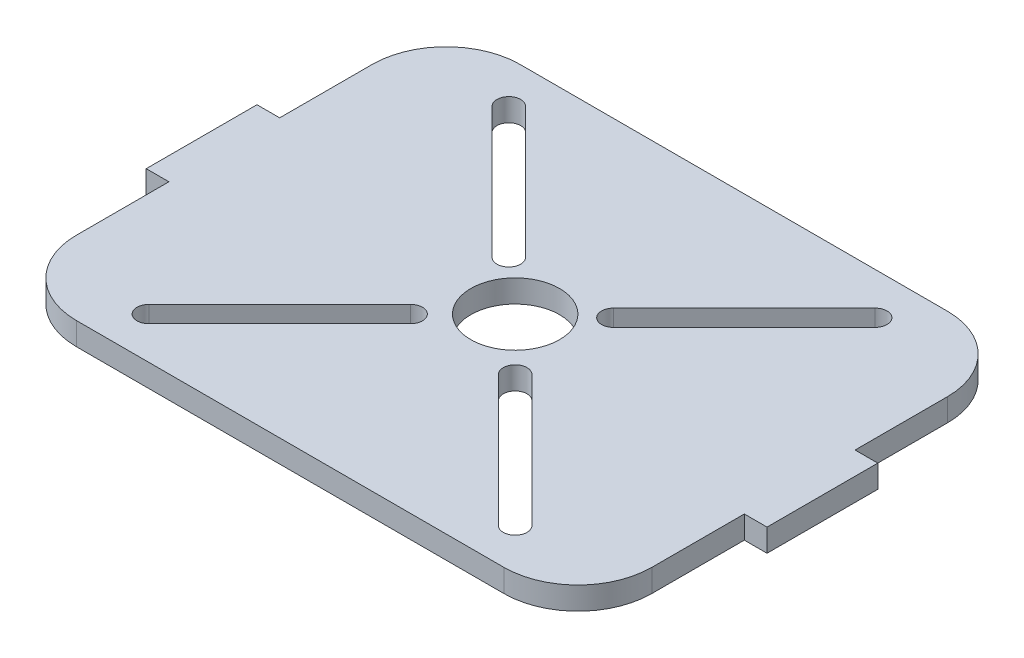
ISO-10303-21;
HEADER;
FILE_DESCRIPTION(('STEP AP214'),'2;1');
FILE_NAME('part.step','',(''),(''),'','','');
FILE_SCHEMA(('AUTOMOTIVE_DESIGN { 1 0 10303 214 1 1 1 1 }'));
ENDSEC;
DATA;
#1=APPLICATION_CONTEXT('core data for automotive mechanical design processes');
#2=APPLICATION_PROTOCOL_DEFINITION('international standard','automotive_design',2000,#1);
#3=PRODUCT_CONTEXT('',#1,'mechanical');
#4=PRODUCT('Part','Part','',(#3));
#5=PRODUCT_RELATED_PRODUCT_CATEGORY('part','',(#4));
#6=PRODUCT_DEFINITION_FORMATION('','',#4);
#7=PRODUCT_DEFINITION_CONTEXT('part definition',#1,'design');
#8=PRODUCT_DEFINITION('design','',#6,#7);
#9=PRODUCT_DEFINITION_SHAPE('','',#8);
#10=(LENGTH_UNIT() NAMED_UNIT(*) SI_UNIT(.MILLI.,.METRE.));
#11=(NAMED_UNIT(*) PLANE_ANGLE_UNIT() SI_UNIT($,.RADIAN.));
#12=(NAMED_UNIT(*) SI_UNIT($,.STERADIAN.) SOLID_ANGLE_UNIT());
#13=UNCERTAINTY_MEASURE_WITH_UNIT(LENGTH_MEASURE(1.E-05),#10,'distance_accuracy_value','');
#14=(GEOMETRIC_REPRESENTATION_CONTEXT(3) GLOBAL_UNCERTAINTY_ASSIGNED_CONTEXT((#13)) GLOBAL_UNIT_ASSIGNED_CONTEXT((#10,
#11,#12)) REPRESENTATION_CONTEXT('',''));
#15=CARTESIAN_POINT('',(0.,0.,0.));
#16=DIRECTION('',(0.,0.,1.));
#17=DIRECTION('',(1.,0.,0.));
#18=AXIS2_PLACEMENT_3D('',#15,#16,#17);
#19=CARTESIAN_POINT('',(0.,-386.85,0.));
#20=DIRECTION('',(0.,-1.,0.));
#21=DIRECTION('',(0.,0.,-1.));
#22=AXIS2_PLACEMENT_3D('',#19,#20,#21);
#23=PLANE('',#22);
#24=DIRECTION('',(-1.,0.,0.));
#25=VECTOR('',#24,1.);
#26=CARTESIAN_POINT('',(-38.9099999999999,-386.85,56.43));
#27=LINE('',#26,#25);
#28=CARTESIAN_POINT('',(28.9099999999999,-386.85,56.43));
#29=VERTEX_POINT('',#28);
#30=CARTESIAN_POINT('',(-28.9099999999999,-386.85,56.43));
#31=VERTEX_POINT('',#30);
#32=EDGE_CURVE('E415',#29,#31,#27,.T.);
#33=ORIENTED_EDGE('',*,*,#32,.T.);
#34=CARTESIAN_POINT('',(-28.9099999999999,-386.85,46.43));
#35=DIRECTION('',(0.,-1.,0.));
#36=DIRECTION('',(0.,0.,-1.));
#37=AXIS2_PLACEMENT_3D('',#34,#35,#36);
#38=CIRCLE('',#37,10.);
#39=CARTESIAN_POINT('',(-38.9099999999999,-386.85,46.43));
#40=VERTEX_POINT('',#39);
#41=EDGE_CURVE('E493',#31,#40,#38,.T.);
#42=ORIENTED_EDGE('',*,*,#41,.T.);
#43=DIRECTION('',(0.,0.,-1.));
#44=VECTOR('',#43,1.);
#45=CARTESIAN_POINT('',(-38.9099999999999,-386.85,33.92));
#46=LINE('',#45,#44);
#47=CARTESIAN_POINT('',(-38.9099999999999,-386.85,33.92));
#48=VERTEX_POINT('',#47);
#49=EDGE_CURVE('E418',#40,#48,#46,.T.);
#50=ORIENTED_EDGE('',*,*,#49,.T.);
#51=DIRECTION('',(-1.,0.,0.));
#52=VECTOR('',#51,1.);
#53=CARTESIAN_POINT('',(-41.9799999999999,-386.85,33.92));
#54=LINE('',#53,#52);
#55=CARTESIAN_POINT('',(-41.9799999999999,-386.85,33.92));
#56=VERTEX_POINT('',#55);
#57=EDGE_CURVE('E420',#48,#56,#54,.T.);
#58=ORIENTED_EDGE('',*,*,#57,.T.);
#59=DIRECTION('',(0.,0.,-1.));
#60=VECTOR('',#59,1.);
#61=CARTESIAN_POINT('',(-41.9799999999999,-386.85,33.92));
#62=LINE('',#61,#60);
#63=CARTESIAN_POINT('',(-41.9799999999999,-386.85,18.94));
#64=VERTEX_POINT('',#63);
#65=EDGE_CURVE('E394',#56,#64,#62,.T.);
#66=ORIENTED_EDGE('',*,*,#65,.T.);
#67=DIRECTION('',(1.,0.,0.));
#68=VECTOR('',#67,1.);
#69=CARTESIAN_POINT('',(-41.9799999999999,-386.85,18.94));
#70=LINE('',#69,#68);
#71=CARTESIAN_POINT('',(-38.9099999999999,-386.85,18.94));
#72=VERTEX_POINT('',#71);
#73=EDGE_CURVE('E397',#64,#72,#70,.T.);
#74=ORIENTED_EDGE('',*,*,#73,.T.);
#75=DIRECTION('',(0.,0.,-1.));
#76=VECTOR('',#75,1.);
#77=CARTESIAN_POINT('',(-38.9099999999999,-386.85,18.94));
#78=LINE('',#77,#76);
#79=CARTESIAN_POINT('',(-38.9099999999999,-386.85,6.43));
#80=VERTEX_POINT('',#79);
#81=EDGE_CURVE('E400',#72,#80,#78,.T.);
#82=ORIENTED_EDGE('',*,*,#81,.T.);
#83=CARTESIAN_POINT('',(-28.9099999999999,-386.85,6.43));
#84=DIRECTION('',(0.,-1.,0.));
#85=DIRECTION('',(0.,0.,-1.));
#86=AXIS2_PLACEMENT_3D('',#83,#84,#85);
#87=CIRCLE('',#86,10.);
#88=CARTESIAN_POINT('',(-28.9099999999999,-386.85,-3.57));
#89=VERTEX_POINT('',#88);
#90=EDGE_CURVE('E491',#80,#89,#87,.T.);
#91=ORIENTED_EDGE('',*,*,#90,.T.);
#92=DIRECTION('',(1.,0.,0.));
#93=VECTOR('',#92,1.);
#94=CARTESIAN_POINT('',(-38.9099999999999,-386.85,-3.57));
#95=LINE('',#94,#93);
#96=CARTESIAN_POINT('',(28.9099999999999,-386.85,-3.57));
#97=VERTEX_POINT('',#96);
#98=EDGE_CURVE('E403',#89,#97,#95,.T.);
#99=ORIENTED_EDGE('',*,*,#98,.T.);
#100=CARTESIAN_POINT('',(28.9099999999999,-386.85,6.43));
#101=DIRECTION('',(0.,-1.,0.));
#102=DIRECTION('',(0.,0.,-1.));
#103=AXIS2_PLACEMENT_3D('',#100,#101,#102);
#104=CIRCLE('',#103,10.);
#105=CARTESIAN_POINT('',(38.9099999999999,-386.85,6.43));
#106=VERTEX_POINT('',#105);
#107=EDGE_CURVE('E64',#97,#106,#104,.T.);
#108=ORIENTED_EDGE('',*,*,#107,.T.);
#109=DIRECTION('',(0.,0.,1.));
#110=VECTOR('',#109,1.);
#111=CARTESIAN_POINT('',(38.9099999999999,-386.85,18.94));
#112=LINE('',#111,#110);
#113=CARTESIAN_POINT('',(38.9099999999999,-386.85,18.94));
#114=VERTEX_POINT('',#113);
#115=EDGE_CURVE('E405',#106,#114,#112,.T.);
#116=ORIENTED_EDGE('',*,*,#115,.T.);
#117=DIRECTION('',(1.,0.,0.));
#118=VECTOR('',#117,1.);
#119=CARTESIAN_POINT('',(41.9799999999999,-386.85,18.94));
#120=LINE('',#119,#118);
#121=CARTESIAN_POINT('',(41.9799999999999,-386.85,18.94));
#122=VERTEX_POINT('',#121);
#123=EDGE_CURVE('E407',#114,#122,#120,.T.);
#124=ORIENTED_EDGE('',*,*,#123,.T.);
#125=DIRECTION('',(0.,0.,1.));
#126=VECTOR('',#125,1.);
#127=CARTESIAN_POINT('',(41.9799999999999,-386.85,33.92));
#128=LINE('',#127,#126);
#129=CARTESIAN_POINT('',(41.9799999999999,-386.85,33.92));
#130=VERTEX_POINT('',#129);
#131=EDGE_CURVE('E409',#122,#130,#128,.T.);
#132=ORIENTED_EDGE('',*,*,#131,.T.);
#133=DIRECTION('',(-1.,0.,0.));
#134=VECTOR('',#133,1.);
#135=CARTESIAN_POINT('',(41.9799999999999,-386.85,33.92));
#136=LINE('',#135,#134);
#137=CARTESIAN_POINT('',(38.9099999999999,-386.85,33.92));
#138=VERTEX_POINT('',#137);
#139=EDGE_CURVE('E411',#130,#138,#136,.T.);
#140=ORIENTED_EDGE('',*,*,#139,.T.);
#141=DIRECTION('',(0.,0.,1.));
#142=VECTOR('',#141,1.);
#143=CARTESIAN_POINT('',(38.9099999999999,-386.85,33.92));
#144=LINE('',#143,#142);
#145=CARTESIAN_POINT('',(38.9099999999999,-386.85,46.43));
#146=VERTEX_POINT('',#145);
#147=EDGE_CURVE('E413',#138,#146,#144,.T.);
#148=ORIENTED_EDGE('',*,*,#147,.T.);
#149=CARTESIAN_POINT('',(28.9099999999999,-386.85,46.43));
#150=DIRECTION('',(0.,-1.,0.));
#151=DIRECTION('',(0.,0.,-1.));
#152=AXIS2_PLACEMENT_3D('',#149,#150,#151);
#153=CIRCLE('',#152,10.);
#154=EDGE_CURVE('E488',#146,#29,#153,.T.);
#155=ORIENTED_EDGE('',*,*,#154,.T.);
#156=EDGE_LOOP('',(#33,#42,#50,#58,#66,#74,#82,#91,#99,#108,#116,#124,#132,#140,#148,#155));
#157=FACE_BOUND('',#156,.T.);
#158=CARTESIAN_POINT('',(0.,-386.85,26.));
#159=DIRECTION('',(0.,-1.,0.));
#160=DIRECTION('',(0.,0.,-1.));
#161=AXIS2_PLACEMENT_3D('',#158,#159,#160);
#162=CIRCLE('',#161,6.);
#163=CARTESIAN_POINT('',(0.,-386.85,20.));
#164=VERTEX_POINT('',#163);
#165=EDGE_CURVE('E388',#164,#164,#162,.T.);
#166=ORIENTED_EDGE('',*,*,#165,.F.);
#167=EDGE_LOOP('',(#166));
#168=FACE_BOUND('',#167,.T.);
#169=DIRECTION('',(0.707106781186546,0.,0.707106781186549));
#170=VECTOR('',#169,1.);
#171=CARTESIAN_POINT('',(8.20243866176394,-386.85,31.939696961967));
#172=LINE('',#171,#170);
#173=CARTESIAN_POINT('',(8.20243866176394,-386.85,31.939696961967));
#174=VERTEX_POINT('',#173);
#175=CARTESIAN_POINT('',(25.904516600406,-386.85,49.6417749006091));
#176=VERTEX_POINT('',#175);
#177=EDGE_CURVE('E359',#174,#176,#172,.T.);
#178=ORIENTED_EDGE('',*,*,#177,.F.);
#179=CARTESIAN_POINT('',(7.07106781186546,-386.85,33.0710678118655));
#180=DIRECTION('',(0.,-1.,0.));
#181=DIRECTION('',(0.,0.,-1.));
#182=AXIS2_PLACEMENT_3D('',#179,#180,#181);
#183=CIRCLE('',#182,1.6);
#184=CARTESIAN_POINT('',(5.93969696196698,-386.85,34.202438661764));
#185=VERTEX_POINT('',#184);
#186=EDGE_CURVE('E357',#185,#174,#183,.T.);
#187=ORIENTED_EDGE('',*,*,#186,.F.);
#188=DIRECTION('',(-0.707106781186546,0.,-0.707106781186549));
#189=VECTOR('',#188,1.);
#190=CARTESIAN_POINT('',(5.93969696196698,-386.85,34.202438661764));
#191=LINE('',#190,#189);
#192=CARTESIAN_POINT('',(23.641774900609,-386.85,51.9045166004061));
#193=VERTEX_POINT('',#192);
#194=EDGE_CURVE('E365',#193,#185,#191,.T.);
#195=ORIENTED_EDGE('',*,*,#194,.F.);
#196=CARTESIAN_POINT('',(24.7731457505075,-386.85,50.7731457505076));
#197=DIRECTION('',(0.,-1.,0.));
#198=DIRECTION('',(0.,0.,-1.));
#199=AXIS2_PLACEMENT_3D('',#196,#197,#198);
#200=CIRCLE('',#199,1.59999999999999);
#201=EDGE_CURVE('E362',#176,#193,#200,.T.);
#202=ORIENTED_EDGE('',*,*,#201,.F.);
#203=EDGE_LOOP('',(#178,#187,#195,#202));
#204=FACE_BOUND('',#203,.T.);
#205=DIRECTION('',(-0.707106781186546,0.,0.707106781186549));
#206=VECTOR('',#205,1.);
#207=CARTESIAN_POINT('',(-5.93969696196698,-386.85,34.202438661764));
#208=LINE('',#207,#206);
#209=CARTESIAN_POINT('',(-5.93969696196698,-386.85,34.202438661764));
#210=VERTEX_POINT('',#209);
#211=CARTESIAN_POINT('',(-23.641774900609,-386.85,51.9045166004061));
#212=VERTEX_POINT('',#211);
#213=EDGE_CURVE('E328',#210,#212,#208,.T.);
#214=ORIENTED_EDGE('',*,*,#213,.F.);
#215=CARTESIAN_POINT('',(-7.07106781186546,-386.85,33.0710678118655));
#216=DIRECTION('',(0.,-1.,0.));
#217=DIRECTION('',(0.,0.,1.));
#218=AXIS2_PLACEMENT_3D('',#215,#216,#217);
#219=CIRCLE('',#218,1.6);
#220=CARTESIAN_POINT('',(-8.20243866176394,-386.85,31.939696961967));
#221=VERTEX_POINT('',#220);
#222=EDGE_CURVE('E326',#221,#210,#219,.T.);
#223=ORIENTED_EDGE('',*,*,#222,.F.);
#224=DIRECTION('',(0.707106781186546,0.,-0.707106781186549));
#225=VECTOR('',#224,1.);
#226=CARTESIAN_POINT('',(-8.20243866176394,-386.85,31.939696961967));
#227=LINE('',#226,#225);
#228=CARTESIAN_POINT('',(-25.904516600406,-386.85,49.6417749006091));
#229=VERTEX_POINT('',#228);
#230=EDGE_CURVE('E334',#229,#221,#227,.T.);
#231=ORIENTED_EDGE('',*,*,#230,.F.);
#232=CARTESIAN_POINT('',(-24.7731457505075,-386.85,50.7731457505076));
#233=DIRECTION('',(0.,-1.,0.));
#234=DIRECTION('',(0.,0.,1.));
#235=AXIS2_PLACEMENT_3D('',#232,#233,#234);
#236=CIRCLE('',#235,1.59999999999999);
#237=EDGE_CURVE('E331',#212,#229,#236,.T.);
#238=ORIENTED_EDGE('',*,*,#237,.F.);
#239=EDGE_LOOP('',(#214,#223,#231,#238));
#240=FACE_BOUND('',#239,.T.);
#241=DIRECTION('',(-0.707106781186546,0.,-0.707106781186549));
#242=VECTOR('',#241,1.);
#243=CARTESIAN_POINT('',(-8.20243866176394,-386.85,20.920303038033));
#244=LINE('',#243,#242);
#245=CARTESIAN_POINT('',(-8.20243866176394,-386.85,20.920303038033));
#246=VERTEX_POINT('',#245);
#247=CARTESIAN_POINT('',(-25.904516600406,-386.85,3.21822509939085));
#248=VERTEX_POINT('',#247);
#249=EDGE_CURVE('E297',#246,#248,#244,.T.);
#250=ORIENTED_EDGE('',*,*,#249,.F.);
#251=CARTESIAN_POINT('',(-7.07106781186546,-386.85,19.7889321881345));
#252=DIRECTION('',(0.,-1.,0.));
#253=DIRECTION('',(0.,0.,-1.));
#254=AXIS2_PLACEMENT_3D('',#251,#252,#253);
#255=CIRCLE('',#254,1.6);
#256=CARTESIAN_POINT('',(-5.93969696196698,-386.85,18.657561338236));
#257=VERTEX_POINT('',#256);
#258=EDGE_CURVE('E295',#257,#246,#255,.T.);
#259=ORIENTED_EDGE('',*,*,#258,.F.);
#260=DIRECTION('',(0.707106781186546,0.,0.707106781186549));
#261=VECTOR('',#260,1.);
#262=CARTESIAN_POINT('',(-5.93969696196698,-386.85,18.657561338236));
#263=LINE('',#262,#261);
#264=CARTESIAN_POINT('',(-23.641774900609,-386.85,0.955483399593917));
#265=VERTEX_POINT('',#264);
#266=EDGE_CURVE('E303',#265,#257,#263,.T.);
#267=ORIENTED_EDGE('',*,*,#266,.F.);
#268=CARTESIAN_POINT('',(-24.7731457505075,-386.85,2.08685424949238));
#269=DIRECTION('',(0.,-1.,0.));
#270=DIRECTION('',(0.,0.,-1.));
#271=AXIS2_PLACEMENT_3D('',#268,#269,#270);
#272=CIRCLE('',#271,1.59999999999999);
#273=EDGE_CURVE('E300',#248,#265,#272,.T.);
#274=ORIENTED_EDGE('',*,*,#273,.F.);
#275=EDGE_LOOP('',(#250,#259,#267,#274));
#276=FACE_BOUND('',#275,.T.);
#277=DIRECTION('',(0.707106781186546,0.,-0.707106781186549));
#278=VECTOR('',#277,1.);
#279=CARTESIAN_POINT('',(5.93969696196698,-386.85,18.657561338236));
#280=LINE('',#279,#278);
#281=CARTESIAN_POINT('',(5.93969696196698,-386.85,18.657561338236));
#282=VERTEX_POINT('',#281);
#283=CARTESIAN_POINT('',(23.641774900609,-386.85,0.955483399593914));
#284=VERTEX_POINT('',#283);
#285=EDGE_CURVE('E264',#282,#284,#280,.T.);
#286=ORIENTED_EDGE('',*,*,#285,.F.);
#287=CARTESIAN_POINT('',(7.07106781186546,-386.85,19.7889321881345));
#288=DIRECTION('',(0.,-1.,0.));
#289=DIRECTION('',(0.,0.,1.));
#290=AXIS2_PLACEMENT_3D('',#287,#288,#289);
#291=CIRCLE('',#290,1.6);
#292=CARTESIAN_POINT('',(8.20243866176394,-386.85,20.920303038033));
#293=VERTEX_POINT('',#292);
#294=EDGE_CURVE('E254',#293,#282,#291,.T.);
#295=ORIENTED_EDGE('',*,*,#294,.F.);
#296=DIRECTION('',(-0.707106781186546,0.,0.707106781186549));
#297=VECTOR('',#296,1.);
#298=CARTESIAN_POINT('',(8.20243866176394,-386.85,20.920303038033));
#299=LINE('',#298,#297);
#300=CARTESIAN_POINT('',(25.904516600406,-386.85,3.21822509939086));
#301=VERTEX_POINT('',#300);
#302=EDGE_CURVE('E279',#301,#293,#299,.T.);
#303=ORIENTED_EDGE('',*,*,#302,.F.);
#304=CARTESIAN_POINT('',(24.7731457505075,-386.85,2.08685424949238));
#305=DIRECTION('',(0.,-1.,0.));
#306=DIRECTION('',(0.,0.,1.));
#307=AXIS2_PLACEMENT_3D('',#304,#305,#306);
#308=CIRCLE('',#307,1.59999999999999);
#309=EDGE_CURVE('E277',#284,#301,#308,.T.);
#310=ORIENTED_EDGE('',*,*,#309,.F.);
#311=EDGE_LOOP('',(#286,#295,#303,#310));
#312=FACE_BOUND('',#311,.T.);
#313=ADVANCED_FACE('F43',(#157,#168,#204,#240,#276,#312),#23,.T.);
#314=CARTESIAN_POINT('',(0.,-383.78,0.));
#315=DIRECTION('',(0.,-1.,0.));
#316=DIRECTION('',(0.,0.,-1.));
#317=AXIS2_PLACEMENT_3D('',#314,#315,#316);
#318=PLANE('',#317);
#319=CARTESIAN_POINT('',(-7.07106781186546,-383.78,19.7889321881345));
#320=DIRECTION('',(0.,-1.,0.));
#321=DIRECTION('',(0.,0.,-1.));
#322=AXIS2_PLACEMENT_3D('',#319,#320,#321);
#323=CIRCLE('',#322,1.6);
#324=CARTESIAN_POINT('',(-5.93969696196698,-383.78,18.657561338236));
#325=VERTEX_POINT('',#324);
#326=CARTESIAN_POINT('',(-8.20243866176394,-383.78,20.920303038033));
#327=VERTEX_POINT('',#326);
#328=EDGE_CURVE('E272',#325,#327,#323,.T.);
#329=ORIENTED_EDGE('',*,*,#328,.T.);
#330=DIRECTION('',(-0.707106781186546,0.,-0.707106781186549));
#331=VECTOR('',#330,1.);
#332=CARTESIAN_POINT('',(-8.20243866176394,-383.78,20.920303038033));
#333=LINE('',#332,#331);
#334=CARTESIAN_POINT('',(-25.904516600406,-383.78,3.21822509939085));
#335=VERTEX_POINT('',#334);
#336=EDGE_CURVE('E308',#327,#335,#333,.T.);
#337=ORIENTED_EDGE('',*,*,#336,.T.);
#338=CARTESIAN_POINT('',(-24.7731457505075,-383.78,2.08685424949238));
#339=DIRECTION('',(0.,-1.,0.));
#340=DIRECTION('',(0.,0.,-1.));
#341=AXIS2_PLACEMENT_3D('',#338,#339,#340);
#342=CIRCLE('',#341,1.59999999999999);
#343=CARTESIAN_POINT('',(-23.641774900609,-383.78,0.955483399593914));
#344=VERTEX_POINT('',#343);
#345=EDGE_CURVE('E311',#335,#344,#342,.T.);
#346=ORIENTED_EDGE('',*,*,#345,.T.);
#347=DIRECTION('',(0.707106781186546,0.,0.707106781186549));
#348=VECTOR('',#347,1.);
#349=CARTESIAN_POINT('',(-5.93969696196698,-383.78,18.657561338236));
#350=LINE('',#349,#348);
#351=EDGE_CURVE('E298',#344,#325,#350,.T.);
#352=ORIENTED_EDGE('',*,*,#351,.T.);
#353=EDGE_LOOP('',(#329,#337,#346,#352));
#354=FACE_BOUND('',#353,.T.);
#355=CARTESIAN_POINT('',(7.07106781186546,-383.78,33.0710678118655));
#356=DIRECTION('',(0.,-1.,0.));
#357=DIRECTION('',(0.,0.,-1.));
#358=AXIS2_PLACEMENT_3D('',#355,#356,#357);
#359=CIRCLE('',#358,1.6);
#360=CARTESIAN_POINT('',(5.93969696196698,-383.78,34.202438661764));
#361=VERTEX_POINT('',#360);
#362=CARTESIAN_POINT('',(8.20243866176394,-383.78,31.939696961967));
#363=VERTEX_POINT('',#362);
#364=EDGE_CURVE('E356',#361,#363,#359,.T.);
#365=ORIENTED_EDGE('',*,*,#364,.T.);
#366=DIRECTION('',(0.707106781186546,0.,0.707106781186549));
#367=VECTOR('',#366,1.);
#368=CARTESIAN_POINT('',(8.20243866176394,-383.78,31.939696961967));
#369=LINE('',#368,#367);
#370=CARTESIAN_POINT('',(25.904516600406,-383.78,49.6417749006091));
#371=VERTEX_POINT('',#370);
#372=EDGE_CURVE('E370',#363,#371,#369,.T.);
#373=ORIENTED_EDGE('',*,*,#372,.T.);
#374=CARTESIAN_POINT('',(24.7731457505075,-383.78,50.7731457505076));
#375=DIRECTION('',(0.,-1.,0.));
#376=DIRECTION('',(0.,0.,-1.));
#377=AXIS2_PLACEMENT_3D('',#374,#375,#376);
#378=CIRCLE('',#377,1.59999999999999);
#379=CARTESIAN_POINT('',(23.641774900609,-383.78,51.9045166004061));
#380=VERTEX_POINT('',#379);
#381=EDGE_CURVE('E373',#371,#380,#378,.T.);
#382=ORIENTED_EDGE('',*,*,#381,.T.);
#383=DIRECTION('',(-0.707106781186546,0.,-0.707106781186549));
#384=VECTOR('',#383,1.);
#385=CARTESIAN_POINT('',(5.93969696196698,-383.78,34.202438661764));
#386=LINE('',#385,#384);
#387=EDGE_CURVE('E360',#380,#361,#386,.T.);
#388=ORIENTED_EDGE('',*,*,#387,.T.);
#389=EDGE_LOOP('',(#365,#373,#382,#388));
#390=FACE_BOUND('',#389,.T.);
#391=DIRECTION('',(0.,0.,-1.));
#392=VECTOR('',#391,1.);
#393=CARTESIAN_POINT('',(-38.9099999999999,-383.78,33.92));
#394=LINE('',#393,#392);
#395=CARTESIAN_POINT('',(-38.9099999999999,-383.78,46.43));
#396=VERTEX_POINT('',#395);
#397=CARTESIAN_POINT('',(-38.9099999999999,-383.78,33.92));
#398=VERTEX_POINT('',#397);
#399=EDGE_CURVE('E446',#396,#398,#394,.T.);
#400=ORIENTED_EDGE('',*,*,#399,.F.);
#401=CARTESIAN_POINT('',(-28.9099999999999,-383.78,46.43));
#402=DIRECTION('',(0.,-1.,0.));
#403=DIRECTION('',(0.,0.,-1.));
#404=AXIS2_PLACEMENT_3D('',#401,#402,#403);
#405=CIRCLE('',#404,10.);
#406=CARTESIAN_POINT('',(-28.9099999999999,-383.78,56.43));
#407=VERTEX_POINT('',#406);
#408=EDGE_CURVE('E481',#396,#407,#405,.F.);
#409=ORIENTED_EDGE('',*,*,#408,.T.);
#410=DIRECTION('',(-1.,0.,0.));
#411=VECTOR('',#410,1.);
#412=CARTESIAN_POINT('',(-38.9099999999999,-383.78,56.43));
#413=LINE('',#412,#411);
#414=CARTESIAN_POINT('',(28.9099999999999,-383.78,56.43));
#415=VERTEX_POINT('',#414);
#416=EDGE_CURVE('E443',#415,#407,#413,.T.);
#417=ORIENTED_EDGE('',*,*,#416,.F.);
#418=CARTESIAN_POINT('',(28.9099999999999,-383.78,46.43));
#419=DIRECTION('',(0.,-1.,0.));
#420=DIRECTION('',(0.,0.,-1.));
#421=AXIS2_PLACEMENT_3D('',#418,#419,#420);
#422=CIRCLE('',#421,10.);
#423=CARTESIAN_POINT('',(38.9099999999999,-383.78,46.43));
#424=VERTEX_POINT('',#423);
#425=EDGE_CURVE('E475',#415,#424,#422,.F.);
#426=ORIENTED_EDGE('',*,*,#425,.T.);
#427=DIRECTION('',(0.,0.,1.));
#428=VECTOR('',#427,1.);
#429=CARTESIAN_POINT('',(38.9099999999999,-383.78,33.92));
#430=LINE('',#429,#428);
#431=CARTESIAN_POINT('',(38.9099999999999,-383.78,33.92));
#432=VERTEX_POINT('',#431);
#433=EDGE_CURVE('E441',#432,#424,#430,.T.);
#434=ORIENTED_EDGE('',*,*,#433,.F.);
#435=DIRECTION('',(-1.,0.,0.));
#436=VECTOR('',#435,1.);
#437=CARTESIAN_POINT('',(41.9799999999999,-383.78,33.92));
#438=LINE('',#437,#436);
#439=CARTESIAN_POINT('',(41.9799999999999,-383.78,33.92));
#440=VERTEX_POINT('',#439);
#441=EDGE_CURVE('E439',#440,#432,#438,.T.);
#442=ORIENTED_EDGE('',*,*,#441,.F.);
#443=DIRECTION('',(0.,0.,1.));
#444=VECTOR('',#443,1.);
#445=CARTESIAN_POINT('',(41.9799999999999,-383.78,33.92));
#446=LINE('',#445,#444);
#447=CARTESIAN_POINT('',(41.9799999999999,-383.78,18.94));
#448=VERTEX_POINT('',#447);
#449=EDGE_CURVE('E437',#448,#440,#446,.T.);
#450=ORIENTED_EDGE('',*,*,#449,.F.);
#451=DIRECTION('',(1.,0.,0.));
#452=VECTOR('',#451,1.);
#453=CARTESIAN_POINT('',(41.9799999999999,-383.78,18.94));
#454=LINE('',#453,#452);
#455=CARTESIAN_POINT('',(38.9099999999999,-383.78,18.94));
#456=VERTEX_POINT('',#455);
#457=EDGE_CURVE('E435',#456,#448,#454,.T.);
#458=ORIENTED_EDGE('',*,*,#457,.F.);
#459=DIRECTION('',(0.,0.,1.));
#460=VECTOR('',#459,1.);
#461=CARTESIAN_POINT('',(38.9099999999999,-383.78,18.94));
#462=LINE('',#461,#460);
#463=CARTESIAN_POINT('',(38.9099999999999,-383.78,6.43));
#464=VERTEX_POINT('',#463);
#465=EDGE_CURVE('E433',#464,#456,#462,.T.);
#466=ORIENTED_EDGE('',*,*,#465,.F.);
#467=CARTESIAN_POINT('',(28.9099999999999,-383.78,6.43));
#468=DIRECTION('',(0.,-1.,0.));
#469=DIRECTION('',(0.,0.,-1.));
#470=AXIS2_PLACEMENT_3D('',#467,#468,#469);
#471=CIRCLE('',#470,10.);
#472=CARTESIAN_POINT('',(28.9099999999999,-383.78,-3.57));
#473=VERTEX_POINT('',#472);
#474=EDGE_CURVE('E477',#464,#473,#471,.F.);
#475=ORIENTED_EDGE('',*,*,#474,.T.);
#476=DIRECTION('',(1.,0.,0.));
#477=VECTOR('',#476,1.);
#478=CARTESIAN_POINT('',(-38.9099999999999,-383.78,-3.57));
#479=LINE('',#478,#477);
#480=CARTESIAN_POINT('',(-28.9099999999999,-383.78,-3.57));
#481=VERTEX_POINT('',#480);
#482=EDGE_CURVE('E430',#481,#473,#479,.T.);
#483=ORIENTED_EDGE('',*,*,#482,.F.);
#484=CARTESIAN_POINT('',(-28.9099999999999,-383.78,6.43));
#485=DIRECTION('',(0.,-1.,0.));
#486=DIRECTION('',(0.,0.,-1.));
#487=AXIS2_PLACEMENT_3D('',#484,#485,#486);
#488=CIRCLE('',#487,10.);
#489=CARTESIAN_POINT('',(-38.9099999999999,-383.78,6.43));
#490=VERTEX_POINT('',#489);
#491=EDGE_CURVE('E479',#481,#490,#488,.F.);
#492=ORIENTED_EDGE('',*,*,#491,.T.);
#493=DIRECTION('',(0.,0.,-1.));
#494=VECTOR('',#493,1.);
#495=CARTESIAN_POINT('',(-38.9099999999999,-383.78,18.94));
#496=LINE('',#495,#494);
#497=CARTESIAN_POINT('',(-38.9099999999999,-383.78,18.94));
#498=VERTEX_POINT('',#497);
#499=EDGE_CURVE('E427',#498,#490,#496,.T.);
#500=ORIENTED_EDGE('',*,*,#499,.F.);
#501=DIRECTION('',(1.,0.,0.));
#502=VECTOR('',#501,1.);
#503=CARTESIAN_POINT('',(-41.9799999999999,-383.78,18.94));
#504=LINE('',#503,#502);
#505=CARTESIAN_POINT('',(-41.9799999999999,-383.78,18.94));
#506=VERTEX_POINT('',#505);
#507=EDGE_CURVE('E425',#506,#498,#504,.T.);
#508=ORIENTED_EDGE('',*,*,#507,.F.);
#509=DIRECTION('',(0.,0.,-1.));
#510=VECTOR('',#509,1.);
#511=CARTESIAN_POINT('',(-41.9799999999999,-383.78,33.92));
#512=LINE('',#511,#510);
#513=CARTESIAN_POINT('',(-41.9799999999999,-383.78,33.92));
#514=VERTEX_POINT('',#513);
#515=EDGE_CURVE('E391',#514,#506,#512,.T.);
#516=ORIENTED_EDGE('',*,*,#515,.F.);
#517=DIRECTION('',(-1.,0.,0.));
#518=VECTOR('',#517,1.);
#519=CARTESIAN_POINT('',(-41.9799999999999,-383.78,33.92));
#520=LINE('',#519,#518);
#521=EDGE_CURVE('E398',#398,#514,#520,.T.);
#522=ORIENTED_EDGE('',*,*,#521,.F.);
#523=EDGE_LOOP('',(#400,#409,#417,#426,#434,#442,#450,#458,#466,#475,#483,#492,#500,#508,#516,#522));
#524=FACE_BOUND('',#523,.T.);
#525=CARTESIAN_POINT('',(0.,-383.78,26.));
#526=DIRECTION('',(0.,-1.,0.));
#527=DIRECTION('',(0.,0.,-1.));
#528=AXIS2_PLACEMENT_3D('',#525,#526,#527);
#529=CIRCLE('',#528,6.);
#530=CARTESIAN_POINT('',(0.,-383.78,20.));
#531=VERTEX_POINT('',#530);
#532=EDGE_CURVE('E387',#531,#531,#529,.T.);
#533=ORIENTED_EDGE('',*,*,#532,.T.);
#534=EDGE_LOOP('',(#533));
#535=FACE_BOUND('',#534,.T.);
#536=CARTESIAN_POINT('',(-7.07106781186546,-383.78,33.0710678118655));
#537=DIRECTION('',(0.,-1.,0.));
#538=DIRECTION('',(0.,0.,1.));
#539=AXIS2_PLACEMENT_3D('',#536,#537,#538);
#540=CIRCLE('',#539,1.6);
#541=CARTESIAN_POINT('',(-8.20243866176394,-383.78,31.939696961967));
#542=VERTEX_POINT('',#541);
#543=CARTESIAN_POINT('',(-5.93969696196698,-383.78,34.202438661764));
#544=VERTEX_POINT('',#543);
#545=EDGE_CURVE('E325',#542,#544,#540,.T.);
#546=ORIENTED_EDGE('',*,*,#545,.T.);
#547=DIRECTION('',(-0.707106781186546,0.,0.707106781186549));
#548=VECTOR('',#547,1.);
#549=CARTESIAN_POINT('',(-5.93969696196698,-383.78,34.202438661764));
#550=LINE('',#549,#548);
#551=CARTESIAN_POINT('',(-23.641774900609,-383.78,51.9045166004061));
#552=VERTEX_POINT('',#551);
#553=EDGE_CURVE('E339',#544,#552,#550,.T.);
#554=ORIENTED_EDGE('',*,*,#553,.T.);
#555=CARTESIAN_POINT('',(-24.7731457505075,-383.78,50.7731457505076));
#556=DIRECTION('',(0.,-1.,0.));
#557=DIRECTION('',(0.,0.,1.));
#558=AXIS2_PLACEMENT_3D('',#555,#556,#557);
#559=CIRCLE('',#558,1.59999999999999);
#560=CARTESIAN_POINT('',(-25.904516600406,-383.78,49.6417749006091));
#561=VERTEX_POINT('',#560);
#562=EDGE_CURVE('E342',#552,#561,#559,.T.);
#563=ORIENTED_EDGE('',*,*,#562,.T.);
#564=DIRECTION('',(0.707106781186546,0.,-0.707106781186549));
#565=VECTOR('',#564,1.);
#566=CARTESIAN_POINT('',(-8.20243866176394,-383.78,31.939696961967));
#567=LINE('',#566,#565);
#568=EDGE_CURVE('E329',#561,#542,#567,.T.);
#569=ORIENTED_EDGE('',*,*,#568,.T.);
#570=EDGE_LOOP('',(#546,#554,#563,#569));
#571=FACE_BOUND('',#570,.T.);
#572=CARTESIAN_POINT('',(7.07106781186546,-383.78,19.7889321881345));
#573=DIRECTION('',(0.,-1.,0.));
#574=DIRECTION('',(0.,0.,1.));
#575=AXIS2_PLACEMENT_3D('',#572,#573,#574);
#576=CIRCLE('',#575,1.6);
#577=CARTESIAN_POINT('',(8.20243866176394,-383.78,20.920303038033));
#578=VERTEX_POINT('',#577);
#579=CARTESIAN_POINT('',(5.93969696196698,-383.78,18.657561338236));
#580=VERTEX_POINT('',#579);
#581=EDGE_CURVE('E283',#578,#580,#576,.T.);
#582=ORIENTED_EDGE('',*,*,#581,.T.);
#583=DIRECTION('',(0.707106781186546,0.,-0.707106781186549));
#584=VECTOR('',#583,1.);
#585=CARTESIAN_POINT('',(5.93969696196698,-383.78,18.657561338236));
#586=LINE('',#585,#584);
#587=CARTESIAN_POINT('',(23.641774900609,-383.78,0.955483399593914));
#588=VERTEX_POINT('',#587);
#589=EDGE_CURVE('E271',#580,#588,#586,.T.);
#590=ORIENTED_EDGE('',*,*,#589,.T.);
#591=CARTESIAN_POINT('',(24.7731457505075,-383.78,2.08685424949238));
#592=DIRECTION('',(0.,-1.,0.));
#593=DIRECTION('',(0.,0.,1.));
#594=AXIS2_PLACEMENT_3D('',#591,#592,#593);
#595=CIRCLE('',#594,1.59999999999999);
#596=CARTESIAN_POINT('',(25.904516600406,-383.78,3.21822509939085));
#597=VERTEX_POINT('',#596);
#598=EDGE_CURVE('E286',#588,#597,#595,.T.);
#599=ORIENTED_EDGE('',*,*,#598,.T.);
#600=DIRECTION('',(-0.707106781186546,0.,0.707106781186549));
#601=VECTOR('',#600,1.);
#602=CARTESIAN_POINT('',(8.20243866176394,-383.78,20.920303038033));
#603=LINE('',#602,#601);
#604=EDGE_CURVE('E265',#597,#578,#603,.T.);
#605=ORIENTED_EDGE('',*,*,#604,.T.);
#606=EDGE_LOOP('',(#582,#590,#599,#605));
#607=FACE_BOUND('',#606,.T.);
#608=ADVANCED_FACE('F511',(#354,#390,#524,#535,#571,#607),#318,.F.);
#609=CARTESIAN_POINT('',(-41.9799999999999,-386.85,33.92));
#610=DIRECTION('',(1.,0.,0.));
#611=DIRECTION('',(0.,0.,-1.));
#612=AXIS2_PLACEMENT_3D('',#609,#610,#611);
#613=PLANE('',#612);
#614=ORIENTED_EDGE('',*,*,#515,.T.);
#615=DIRECTION('',(0.,1.,0.));
#616=VECTOR('',#615,1.);
#617=CARTESIAN_POINT('',(-41.9799999999999,-386.85,18.94));
#618=LINE('',#617,#616);
#619=EDGE_CURVE('E469',#64,#506,#618,.T.);
#620=ORIENTED_EDGE('',*,*,#619,.F.);
#621=ORIENTED_EDGE('',*,*,#65,.F.);
#622=DIRECTION('',(0.,1.,0.));
#623=VECTOR('',#622,1.);
#624=CARTESIAN_POINT('',(-41.9799999999999,-386.85,33.92));
#625=LINE('',#624,#623);
#626=EDGE_CURVE('E422',#56,#514,#625,.T.);
#627=ORIENTED_EDGE('',*,*,#626,.T.);
#628=EDGE_LOOP('',(#614,#620,#621,#627));
#629=FACE_BOUND('',#628,.T.);
#630=ADVANCED_FACE('F550',(#629),#613,.F.);
#631=CARTESIAN_POINT('',(-41.9799999999999,-386.85,18.94));
#632=DIRECTION('',(0.,0.,1.));
#633=DIRECTION('',(1.,0.,0.));
#634=AXIS2_PLACEMENT_3D('',#631,#632,#633);
#635=PLANE('',#634);
#636=ORIENTED_EDGE('',*,*,#507,.T.);
#637=DIRECTION('',(0.,1.,0.));
#638=VECTOR('',#637,1.);
#639=CARTESIAN_POINT('',(-38.9099999999999,-386.85,18.94));
#640=LINE('',#639,#638);
#641=EDGE_CURVE('E466',#72,#498,#640,.T.);
#642=ORIENTED_EDGE('',*,*,#641,.F.);
#643=ORIENTED_EDGE('',*,*,#73,.F.);
#644=ORIENTED_EDGE('',*,*,#619,.T.);
#645=EDGE_LOOP('',(#636,#642,#643,#644));
#646=FACE_BOUND('',#645,.T.);
#647=ADVANCED_FACE('F598',(#646),#635,.F.);
#648=CARTESIAN_POINT('',(-38.9099999999999,-386.85,18.94));
#649=DIRECTION('',(1.,0.,0.));
#650=DIRECTION('',(0.,0.,-1.));
#651=AXIS2_PLACEMENT_3D('',#648,#649,#650);
#652=PLANE('',#651);
#653=ORIENTED_EDGE('',*,*,#499,.T.);
#654=DIRECTION('',(0.,1.,0.));
#655=VECTOR('',#654,1.);
#656=CARTESIAN_POINT('',(-38.9099999999999,-386.85,6.43));
#657=LINE('',#656,#655);
#658=EDGE_CURVE('E500',#490,#80,#657,.F.);
#659=ORIENTED_EDGE('',*,*,#658,.T.);
#660=ORIENTED_EDGE('',*,*,#81,.F.);
#661=ORIENTED_EDGE('',*,*,#641,.T.);
#662=EDGE_LOOP('',(#653,#659,#660,#661));
#663=FACE_BOUND('',#662,.T.);
#664=ADVANCED_FACE('F602',(#663),#652,.F.);
#665=CARTESIAN_POINT('',(-38.9099999999999,-386.85,-3.57));
#666=DIRECTION('',(0.,0.,1.));
#667=DIRECTION('',(1.,0.,0.));
#668=AXIS2_PLACEMENT_3D('',#665,#666,#667);
#669=PLANE('',#668);
#670=ORIENTED_EDGE('',*,*,#98,.F.);
#671=DIRECTION('',(0.,1.,0.));
#672=VECTOR('',#671,1.);
#673=CARTESIAN_POINT('',(-28.9099999999999,-386.85,-3.57));
#674=LINE('',#673,#672);
#675=EDGE_CURVE('E497',#89,#481,#674,.T.);
#676=ORIENTED_EDGE('',*,*,#675,.T.);
#677=ORIENTED_EDGE('',*,*,#482,.T.);
#678=DIRECTION('',(0.,1.,0.));
#679=VECTOR('',#678,1.);
#680=CARTESIAN_POINT('',(28.9099999999999,-386.85,-3.57));
#681=LINE('',#680,#679);
#682=EDGE_CURVE('E495',#473,#97,#681,.F.);
#683=ORIENTED_EDGE('',*,*,#682,.T.);
#684=EDGE_LOOP('',(#670,#676,#677,#683));
#685=FACE_BOUND('',#684,.T.);
#686=ADVANCED_FACE('F606',(#685),#669,.F.);
#687=CARTESIAN_POINT('',(38.9099999999999,-386.85,18.94));
#688=DIRECTION('',(-1.,0.,0.));
#689=DIRECTION('',(0.,0.,1.));
#690=AXIS2_PLACEMENT_3D('',#687,#688,#689);
#691=PLANE('',#690);
#692=ORIENTED_EDGE('',*,*,#115,.F.);
#693=DIRECTION('',(0.,1.,0.));
#694=VECTOR('',#693,1.);
#695=CARTESIAN_POINT('',(38.9099999999999,-386.85,6.43));
#696=LINE('',#695,#694);
#697=EDGE_CURVE('E51',#106,#464,#696,.T.);
#698=ORIENTED_EDGE('',*,*,#697,.T.);
#699=ORIENTED_EDGE('',*,*,#465,.T.);
#700=DIRECTION('',(0.,1.,0.));
#701=VECTOR('',#700,1.);
#702=CARTESIAN_POINT('',(38.9099999999999,-386.85,18.94));
#703=LINE('',#702,#701);
#704=EDGE_CURVE('E463',#114,#456,#703,.T.);
#705=ORIENTED_EDGE('',*,*,#704,.F.);
#706=EDGE_LOOP('',(#692,#698,#699,#705));
#707=FACE_BOUND('',#706,.T.);
#708=ADVANCED_FACE('F505',(#707),#691,.F.);
#709=CARTESIAN_POINT('',(41.9799999999999,-386.85,18.94));
#710=DIRECTION('',(0.,0.,1.));
#711=DIRECTION('',(1.,0.,0.));
#712=AXIS2_PLACEMENT_3D('',#709,#710,#711);
#713=PLANE('',#712);
#714=ORIENTED_EDGE('',*,*,#457,.T.);
#715=DIRECTION('',(0.,1.,0.));
#716=VECTOR('',#715,1.);
#717=CARTESIAN_POINT('',(41.9799999999999,-386.85,18.94));
#718=LINE('',#717,#716);
#719=EDGE_CURVE('E460',#122,#448,#718,.T.);
#720=ORIENTED_EDGE('',*,*,#719,.F.);
#721=ORIENTED_EDGE('',*,*,#123,.F.);
#722=ORIENTED_EDGE('',*,*,#704,.T.);
#723=EDGE_LOOP('',(#714,#720,#721,#722));
#724=FACE_BOUND('',#723,.T.);
#725=ADVANCED_FACE('F518',(#724),#713,.F.);
#726=CARTESIAN_POINT('',(41.9799999999999,-386.85,33.92));
#727=DIRECTION('',(-1.,0.,0.));
#728=DIRECTION('',(0.,0.,1.));
#729=AXIS2_PLACEMENT_3D('',#726,#727,#728);
#730=PLANE('',#729);
#731=ORIENTED_EDGE('',*,*,#449,.T.);
#732=DIRECTION('',(0.,1.,0.));
#733=VECTOR('',#732,1.);
#734=CARTESIAN_POINT('',(41.9799999999999,-386.85,33.92));
#735=LINE('',#734,#733);
#736=EDGE_CURVE('E457',#130,#440,#735,.T.);
#737=ORIENTED_EDGE('',*,*,#736,.F.);
#738=ORIENTED_EDGE('',*,*,#131,.F.);
#739=ORIENTED_EDGE('',*,*,#719,.T.);
#740=EDGE_LOOP('',(#731,#737,#738,#739));
#741=FACE_BOUND('',#740,.T.);
#742=ADVANCED_FACE('F522',(#741),#730,.F.);
#743=CARTESIAN_POINT('',(41.9799999999999,-386.85,33.92));
#744=DIRECTION('',(0.,0.,-1.));
#745=DIRECTION('',(-1.,0.,0.));
#746=AXIS2_PLACEMENT_3D('',#743,#744,#745);
#747=PLANE('',#746);
#748=ORIENTED_EDGE('',*,*,#441,.T.);
#749=DIRECTION('',(0.,1.,0.));
#750=VECTOR('',#749,1.);
#751=CARTESIAN_POINT('',(38.9099999999999,-386.85,33.92));
#752=LINE('',#751,#750);
#753=EDGE_CURVE('E454',#138,#432,#752,.T.);
#754=ORIENTED_EDGE('',*,*,#753,.F.);
#755=ORIENTED_EDGE('',*,*,#139,.F.);
#756=ORIENTED_EDGE('',*,*,#736,.T.);
#757=EDGE_LOOP('',(#748,#754,#755,#756));
#758=FACE_BOUND('',#757,.T.);
#759=ADVANCED_FACE('F529',(#758),#747,.F.);
#760=CARTESIAN_POINT('',(38.9099999999999,-386.85,33.92));
#761=DIRECTION('',(-1.,0.,0.));
#762=DIRECTION('',(0.,0.,1.));
#763=AXIS2_PLACEMENT_3D('',#760,#761,#762);
#764=PLANE('',#763);
#765=ORIENTED_EDGE('',*,*,#433,.T.);
#766=DIRECTION('',(0.,1.,0.));
#767=VECTOR('',#766,1.);
#768=CARTESIAN_POINT('',(38.9099999999999,-386.85,46.43));
#769=LINE('',#768,#767);
#770=EDGE_CURVE('E11',#424,#146,#769,.F.);
#771=ORIENTED_EDGE('',*,*,#770,.T.);
#772=ORIENTED_EDGE('',*,*,#147,.F.);
#773=ORIENTED_EDGE('',*,*,#753,.T.);
#774=EDGE_LOOP('',(#765,#771,#772,#773));
#775=FACE_BOUND('',#774,.T.);
#776=ADVANCED_FACE('F531',(#775),#764,.F.);
#777=CARTESIAN_POINT('',(-38.9099999999999,-386.85,56.43));
#778=DIRECTION('',(0.,0.,-1.));
#779=DIRECTION('',(-1.,0.,0.));
#780=AXIS2_PLACEMENT_3D('',#777,#778,#779);
#781=PLANE('',#780);
#782=ORIENTED_EDGE('',*,*,#416,.T.);
#783=DIRECTION('',(0.,1.,0.));
#784=VECTOR('',#783,1.);
#785=CARTESIAN_POINT('',(-28.9099999999999,-386.85,56.43));
#786=LINE('',#785,#784);
#787=EDGE_CURVE('E486',#407,#31,#786,.F.);
#788=ORIENTED_EDGE('',*,*,#787,.T.);
#789=ORIENTED_EDGE('',*,*,#32,.F.);
#790=DIRECTION('',(0.,1.,0.));
#791=VECTOR('',#790,1.);
#792=CARTESIAN_POINT('',(28.9099999999999,-386.85,56.43));
#793=LINE('',#792,#791);
#794=EDGE_CURVE('E483',#29,#415,#793,.T.);
#795=ORIENTED_EDGE('',*,*,#794,.T.);
#796=EDGE_LOOP('',(#782,#788,#789,#795));
#797=FACE_BOUND('',#796,.T.);
#798=ADVANCED_FACE('F533',(#797),#781,.F.);
#799=CARTESIAN_POINT('',(-38.9099999999999,-386.85,33.92));
#800=DIRECTION('',(1.,0.,0.));
#801=DIRECTION('',(0.,0.,-1.));
#802=AXIS2_PLACEMENT_3D('',#799,#800,#801);
#803=PLANE('',#802);
#804=ORIENTED_EDGE('',*,*,#49,.F.);
#805=DIRECTION('',(0.,1.,0.));
#806=VECTOR('',#805,1.);
#807=CARTESIAN_POINT('',(-38.9099999999999,-386.85,46.43));
#808=LINE('',#807,#806);
#809=EDGE_CURVE('E472',#40,#396,#808,.T.);
#810=ORIENTED_EDGE('',*,*,#809,.T.);
#811=ORIENTED_EDGE('',*,*,#399,.T.);
#812=DIRECTION('',(0.,1.,0.));
#813=VECTOR('',#812,1.);
#814=CARTESIAN_POINT('',(-38.9099999999999,-386.85,33.92));
#815=LINE('',#814,#813);
#816=EDGE_CURVE('E451',#48,#398,#815,.T.);
#817=ORIENTED_EDGE('',*,*,#816,.F.);
#818=EDGE_LOOP('',(#804,#810,#811,#817));
#819=FACE_BOUND('',#818,.T.);
#820=ADVANCED_FACE('F540',(#819),#803,.F.);
#821=CARTESIAN_POINT('',(-41.9799999999999,-386.85,33.92));
#822=DIRECTION('',(0.,0.,-1.));
#823=DIRECTION('',(-1.,0.,0.));
#824=AXIS2_PLACEMENT_3D('',#821,#822,#823);
#825=PLANE('',#824);
#826=ORIENTED_EDGE('',*,*,#521,.T.);
#827=ORIENTED_EDGE('',*,*,#626,.F.);
#828=ORIENTED_EDGE('',*,*,#57,.F.);
#829=ORIENTED_EDGE('',*,*,#816,.T.);
#830=EDGE_LOOP('',(#826,#827,#828,#829));
#831=FACE_BOUND('',#830,.T.);
#832=ADVANCED_FACE('F557',(#831),#825,.F.);
#833=CARTESIAN_POINT('',(0.,-386.85,26.));
#834=DIRECTION('',(0.,1.,0.));
#835=DIRECTION('',(0.,0.,1.));
#836=AXIS2_PLACEMENT_3D('',#833,#834,#835);
#837=CYLINDRICAL_SURFACE('',#836,6.);
#838=ORIENTED_EDGE('',*,*,#165,.T.);
#839=EDGE_LOOP('',(#838));
#840=FACE_BOUND('',#839,.T.);
#841=ORIENTED_EDGE('',*,*,#532,.F.);
#842=EDGE_LOOP('',(#841));
#843=FACE_BOUND('',#842,.T.);
#844=ADVANCED_FACE('F554',(#840,#843),#837,.F.);
#845=CARTESIAN_POINT('',(7.07106781186546,-386.85,33.0710678118655));
#846=DIRECTION('',(0.,1.,0.));
#847=DIRECTION('',(0.,0.,1.));
#848=AXIS2_PLACEMENT_3D('',#845,#846,#847);
#849=CYLINDRICAL_SURFACE('',#848,1.6);
#850=ORIENTED_EDGE('',*,*,#364,.F.);
#851=DIRECTION('',(0.,1.,0.));
#852=VECTOR('',#851,1.);
#853=CARTESIAN_POINT('',(5.93969696196698,-386.85,34.202438661764));
#854=LINE('',#853,#852);
#855=EDGE_CURVE('E367',#185,#361,#854,.T.);
#856=ORIENTED_EDGE('',*,*,#855,.F.);
#857=ORIENTED_EDGE('',*,*,#186,.T.);
#858=DIRECTION('',(0.,1.,0.));
#859=VECTOR('',#858,1.);
#860=CARTESIAN_POINT('',(8.20243866176394,-386.85,31.939696961967));
#861=LINE('',#860,#859);
#862=EDGE_CURVE('E384',#174,#363,#861,.T.);
#863=ORIENTED_EDGE('',*,*,#862,.T.);
#864=EDGE_LOOP('',(#850,#856,#857,#863));
#865=FACE_BOUND('',#864,.T.);
#866=ADVANCED_FACE('F709',(#865),#849,.F.);
#867=CARTESIAN_POINT('',(8.20243866176394,-386.85,31.939696961967));
#868=DIRECTION('',(-0.707106781186549,0.,0.707106781186546));
#869=DIRECTION('',(0.707106781186546,0.,0.707106781186549));
#870=AXIS2_PLACEMENT_3D('',#867,#868,#869);
#871=PLANE('',#870);
#872=ORIENTED_EDGE('',*,*,#372,.F.);
#873=ORIENTED_EDGE('',*,*,#862,.F.);
#874=ORIENTED_EDGE('',*,*,#177,.T.);
#875=DIRECTION('',(0.,1.,0.));
#876=VECTOR('',#875,1.);
#877=CARTESIAN_POINT('',(25.904516600406,-386.85,49.6417749006091));
#878=LINE('',#877,#876);
#879=EDGE_CURVE('E382',#176,#371,#878,.T.);
#880=ORIENTED_EDGE('',*,*,#879,.T.);
#881=EDGE_LOOP('',(#872,#873,#874,#880));
#882=FACE_BOUND('',#881,.T.);
#883=ADVANCED_FACE('F716',(#882),#871,.T.);
#884=CARTESIAN_POINT('',(24.7731457505075,-386.85,50.7731457505076));
#885=DIRECTION('',(0.,1.,0.));
#886=DIRECTION('',(0.,0.,1.));
#887=AXIS2_PLACEMENT_3D('',#884,#885,#886);
#888=CYLINDRICAL_SURFACE('',#887,1.59999999999999);
#889=ORIENTED_EDGE('',*,*,#381,.F.);
#890=ORIENTED_EDGE('',*,*,#879,.F.);
#891=ORIENTED_EDGE('',*,*,#201,.T.);
#892=DIRECTION('',(0.,1.,0.));
#893=VECTOR('',#892,1.);
#894=CARTESIAN_POINT('',(23.641774900609,-386.85,51.9045166004061));
#895=LINE('',#894,#893);
#896=EDGE_CURVE('E380',#193,#380,#895,.T.);
#897=ORIENTED_EDGE('',*,*,#896,.T.);
#898=EDGE_LOOP('',(#889,#890,#891,#897));
#899=FACE_BOUND('',#898,.T.);
#900=ADVANCED_FACE('F723',(#899),#888,.F.);
#901=CARTESIAN_POINT('',(5.93969696196698,-386.85,34.202438661764));
#902=DIRECTION('',(0.707106781186549,0.,-0.707106781186546));
#903=DIRECTION('',(-0.707106781186546,0.,-0.707106781186549));
#904=AXIS2_PLACEMENT_3D('',#901,#902,#903);
#905=PLANE('',#904);
#906=ORIENTED_EDGE('',*,*,#387,.F.);
#907=ORIENTED_EDGE('',*,*,#896,.F.);
#908=ORIENTED_EDGE('',*,*,#194,.T.);
#909=ORIENTED_EDGE('',*,*,#855,.T.);
#910=EDGE_LOOP('',(#906,#907,#908,#909));
#911=FACE_BOUND('',#910,.T.);
#912=ADVANCED_FACE('F731',(#911),#905,.T.);
#913=CARTESIAN_POINT('',(-7.07106781186546,-386.85,33.0710678118655));
#914=DIRECTION('',(0.,1.,0.));
#915=DIRECTION('',(0.,0.,1.));
#916=AXIS2_PLACEMENT_3D('',#913,#914,#915);
#917=CYLINDRICAL_SURFACE('',#916,1.6);
#918=ORIENTED_EDGE('',*,*,#545,.F.);
#919=DIRECTION('',(0.,1.,0.));
#920=VECTOR('',#919,1.);
#921=CARTESIAN_POINT('',(-8.20243866176394,-386.85,31.939696961967));
#922=LINE('',#921,#920);
#923=EDGE_CURVE('E336',#221,#542,#922,.T.);
#924=ORIENTED_EDGE('',*,*,#923,.F.);
#925=ORIENTED_EDGE('',*,*,#222,.T.);
#926=DIRECTION('',(0.,1.,0.));
#927=VECTOR('',#926,1.);
#928=CARTESIAN_POINT('',(-5.93969696196698,-386.85,34.202438661764));
#929=LINE('',#928,#927);
#930=EDGE_CURVE('E353',#210,#544,#929,.T.);
#931=ORIENTED_EDGE('',*,*,#930,.T.);
#932=EDGE_LOOP('',(#918,#924,#925,#931));
#933=FACE_BOUND('',#932,.T.);
#934=ADVANCED_FACE('F739',(#933),#917,.F.);
#935=CARTESIAN_POINT('',(-5.93969696196698,-386.85,34.202438661764));
#936=DIRECTION('',(-0.707106781186549,0.,-0.707106781186546));
#937=DIRECTION('',(-0.707106781186546,0.,0.707106781186549));
#938=AXIS2_PLACEMENT_3D('',#935,#936,#937);
#939=PLANE('',#938);
#940=ORIENTED_EDGE('',*,*,#553,.F.);
#941=ORIENTED_EDGE('',*,*,#930,.F.);
#942=ORIENTED_EDGE('',*,*,#213,.T.);
#943=DIRECTION('',(0.,1.,0.));
#944=VECTOR('',#943,1.);
#945=CARTESIAN_POINT('',(-23.641774900609,-386.85,51.9045166004061));
#946=LINE('',#945,#944);
#947=EDGE_CURVE('E351',#212,#552,#946,.T.);
#948=ORIENTED_EDGE('',*,*,#947,.T.);
#949=EDGE_LOOP('',(#940,#941,#942,#948));
#950=FACE_BOUND('',#949,.T.);
#951=ADVANCED_FACE('F747',(#950),#939,.T.);
#952=CARTESIAN_POINT('',(-24.7731457505075,-386.85,50.7731457505076));
#953=DIRECTION('',(0.,1.,0.));
#954=DIRECTION('',(0.,0.,1.));
#955=AXIS2_PLACEMENT_3D('',#952,#953,#954);
#956=CYLINDRICAL_SURFACE('',#955,1.59999999999999);
#957=ORIENTED_EDGE('',*,*,#562,.F.);
#958=ORIENTED_EDGE('',*,*,#947,.F.);
#959=ORIENTED_EDGE('',*,*,#237,.T.);
#960=DIRECTION('',(0.,1.,0.));
#961=VECTOR('',#960,1.);
#962=CARTESIAN_POINT('',(-25.904516600406,-386.85,49.6417749006091));
#963=LINE('',#962,#961);
#964=EDGE_CURVE('E349',#229,#561,#963,.T.);
#965=ORIENTED_EDGE('',*,*,#964,.T.);
#966=EDGE_LOOP('',(#957,#958,#959,#965));
#967=FACE_BOUND('',#966,.T.);
#968=ADVANCED_FACE('F755',(#967),#956,.F.);
#969=CARTESIAN_POINT('',(-8.20243866176394,-386.85,31.939696961967));
#970=DIRECTION('',(0.707106781186549,0.,0.707106781186546));
#971=DIRECTION('',(0.707106781186546,0.,-0.707106781186549));
#972=AXIS2_PLACEMENT_3D('',#969,#970,#971);
#973=PLANE('',#972);
#974=ORIENTED_EDGE('',*,*,#568,.F.);
#975=ORIENTED_EDGE('',*,*,#964,.F.);
#976=ORIENTED_EDGE('',*,*,#230,.T.);
#977=ORIENTED_EDGE('',*,*,#923,.T.);
#978=EDGE_LOOP('',(#974,#975,#976,#977));
#979=FACE_BOUND('',#978,.T.);
#980=ADVANCED_FACE('F763',(#979),#973,.T.);
#981=CARTESIAN_POINT('',(-7.07106781186546,-386.85,19.7889321881345));
#982=DIRECTION('',(0.,1.,0.));
#983=DIRECTION('',(0.,0.,1.));
#984=AXIS2_PLACEMENT_3D('',#981,#982,#983);
#985=CYLINDRICAL_SURFACE('',#984,1.6);
#986=ORIENTED_EDGE('',*,*,#328,.F.);
#987=DIRECTION('',(0.,1.,0.));
#988=VECTOR('',#987,1.);
#989=CARTESIAN_POINT('',(-5.93969696196698,-386.85,18.657561338236));
#990=LINE('',#989,#988);
#991=EDGE_CURVE('E305',#257,#325,#990,.T.);
#992=ORIENTED_EDGE('',*,*,#991,.F.);
#993=ORIENTED_EDGE('',*,*,#258,.T.);
#994=DIRECTION('',(0.,1.,0.));
#995=VECTOR('',#994,1.);
#996=CARTESIAN_POINT('',(-8.20243866176394,-386.85,20.920303038033));
#997=LINE('',#996,#995);
#998=EDGE_CURVE('E322',#246,#327,#997,.T.);
#999=ORIENTED_EDGE('',*,*,#998,.T.);
#1000=EDGE_LOOP('',(#986,#992,#993,#999));
#1001=FACE_BOUND('',#1000,.T.);
#1002=ADVANCED_FACE('F771',(#1001),#985,.F.);
#1003=CARTESIAN_POINT('',(-8.20243866176394,-386.85,20.920303038033));
#1004=DIRECTION('',(0.707106781186549,0.,-0.707106781186546));
#1005=DIRECTION('',(-0.707106781186546,0.,-0.707106781186549));
#1006=AXIS2_PLACEMENT_3D('',#1003,#1004,#1005);
#1007=PLANE('',#1006);
#1008=ORIENTED_EDGE('',*,*,#336,.F.);
#1009=ORIENTED_EDGE('',*,*,#998,.F.);
#1010=ORIENTED_EDGE('',*,*,#249,.T.);
#1011=DIRECTION('',(0.,1.,0.));
#1012=VECTOR('',#1011,1.);
#1013=CARTESIAN_POINT('',(-25.904516600406,-386.85,3.21822509939085));
#1014=LINE('',#1013,#1012);
#1015=EDGE_CURVE('E320',#248,#335,#1014,.T.);
#1016=ORIENTED_EDGE('',*,*,#1015,.T.);
#1017=EDGE_LOOP('',(#1008,#1009,#1010,#1016));
#1018=FACE_BOUND('',#1017,.T.);
#1019=ADVANCED_FACE('F779',(#1018),#1007,.T.);
#1020=CARTESIAN_POINT('',(-24.7731457505075,-386.85,2.08685424949238));
#1021=DIRECTION('',(0.,1.,0.));
#1022=DIRECTION('',(0.,0.,1.));
#1023=AXIS2_PLACEMENT_3D('',#1020,#1021,#1022);
#1024=CYLINDRICAL_SURFACE('',#1023,1.59999999999999);
#1025=ORIENTED_EDGE('',*,*,#345,.F.);
#1026=ORIENTED_EDGE('',*,*,#1015,.F.);
#1027=ORIENTED_EDGE('',*,*,#273,.T.);
#1028=DIRECTION('',(0.,1.,0.));
#1029=VECTOR('',#1028,1.);
#1030=CARTESIAN_POINT('',(-23.641774900609,-386.85,0.955483399593914));
#1031=LINE('',#1030,#1029);
#1032=EDGE_CURVE('E318',#265,#344,#1031,.T.);
#1033=ORIENTED_EDGE('',*,*,#1032,.T.);
#1034=EDGE_LOOP('',(#1025,#1026,#1027,#1033));
#1035=FACE_BOUND('',#1034,.T.);
#1036=ADVANCED_FACE('F787',(#1035),#1024,.F.);
#1037=CARTESIAN_POINT('',(-5.93969696196698,-386.85,18.657561338236));
#1038=DIRECTION('',(-0.707106781186549,0.,0.707106781186546));
#1039=DIRECTION('',(0.707106781186546,0.,0.707106781186549));
#1040=AXIS2_PLACEMENT_3D('',#1037,#1038,#1039);
#1041=PLANE('',#1040);
#1042=ORIENTED_EDGE('',*,*,#351,.F.);
#1043=ORIENTED_EDGE('',*,*,#1032,.F.);
#1044=ORIENTED_EDGE('',*,*,#266,.T.);
#1045=ORIENTED_EDGE('',*,*,#991,.T.);
#1046=EDGE_LOOP('',(#1042,#1043,#1044,#1045));
#1047=FACE_BOUND('',#1046,.T.);
#1048=ADVANCED_FACE('F795',(#1047),#1041,.T.);
#1049=CARTESIAN_POINT('',(7.07106781186546,-386.85,19.7889321881345));
#1050=DIRECTION('',(0.,1.,0.));
#1051=DIRECTION('',(0.,0.,1.));
#1052=AXIS2_PLACEMENT_3D('',#1049,#1050,#1051);
#1053=CYLINDRICAL_SURFACE('',#1052,1.6);
#1054=ORIENTED_EDGE('',*,*,#581,.F.);
#1055=DIRECTION('',(0.,1.,0.));
#1056=VECTOR('',#1055,1.);
#1057=CARTESIAN_POINT('',(8.20243866176394,-386.85,20.920303038033));
#1058=LINE('',#1057,#1056);
#1059=EDGE_CURVE('E260',#293,#578,#1058,.T.);
#1060=ORIENTED_EDGE('',*,*,#1059,.F.);
#1061=ORIENTED_EDGE('',*,*,#294,.T.);
#1062=DIRECTION('',(0.,1.,0.));
#1063=VECTOR('',#1062,1.);
#1064=CARTESIAN_POINT('',(5.93969696196698,-386.85,18.657561338236));
#1065=LINE('',#1064,#1063);
#1066=EDGE_CURVE('E257',#282,#580,#1065,.T.);
#1067=ORIENTED_EDGE('',*,*,#1066,.T.);
#1068=EDGE_LOOP('',(#1054,#1060,#1061,#1067));
#1069=FACE_BOUND('',#1068,.T.);
#1070=ADVANCED_FACE('F256',(#1069),#1053,.F.);
#1071=CARTESIAN_POINT('',(5.93969696196698,-386.85,18.657561338236));
#1072=DIRECTION('',(0.707106781186549,0.,0.707106781186546));
#1073=DIRECTION('',(0.707106781186546,0.,-0.707106781186549));
#1074=AXIS2_PLACEMENT_3D('',#1071,#1072,#1073);
#1075=PLANE('',#1074);
#1076=ORIENTED_EDGE('',*,*,#589,.F.);
#1077=ORIENTED_EDGE('',*,*,#1066,.F.);
#1078=ORIENTED_EDGE('',*,*,#285,.T.);
#1079=DIRECTION('',(0.,1.,0.));
#1080=VECTOR('',#1079,1.);
#1081=CARTESIAN_POINT('',(23.641774900609,-386.85,0.955483399593914));
#1082=LINE('',#1081,#1080);
#1083=EDGE_CURVE('E273',#284,#588,#1082,.T.);
#1084=ORIENTED_EDGE('',*,*,#1083,.T.);
#1085=EDGE_LOOP('',(#1076,#1077,#1078,#1084));
#1086=FACE_BOUND('',#1085,.T.);
#1087=ADVANCED_FACE('F268',(#1086),#1075,.T.);
#1088=CARTESIAN_POINT('',(24.7731457505075,-386.85,2.08685424949238));
#1089=DIRECTION('',(0.,1.,0.));
#1090=DIRECTION('',(0.,0.,1.));
#1091=AXIS2_PLACEMENT_3D('',#1088,#1089,#1090);
#1092=CYLINDRICAL_SURFACE('',#1091,1.59999999999999);
#1093=ORIENTED_EDGE('',*,*,#598,.F.);
#1094=ORIENTED_EDGE('',*,*,#1083,.F.);
#1095=ORIENTED_EDGE('',*,*,#309,.T.);
#1096=DIRECTION('',(0.,1.,0.));
#1097=VECTOR('',#1096,1.);
#1098=CARTESIAN_POINT('',(25.904516600406,-386.85,3.21822509939085));
#1099=LINE('',#1098,#1097);
#1100=EDGE_CURVE('E292',#301,#597,#1099,.T.);
#1101=ORIENTED_EDGE('',*,*,#1100,.T.);
#1102=EDGE_LOOP('',(#1093,#1094,#1095,#1101));
#1103=FACE_BOUND('',#1102,.T.);
#1104=ADVANCED_FACE('F816',(#1103),#1092,.F.);
#1105=CARTESIAN_POINT('',(8.20243866176394,-386.85,20.920303038033));
#1106=DIRECTION('',(-0.707106781186549,0.,-0.707106781186546));
#1107=DIRECTION('',(-0.707106781186546,0.,0.707106781186549));
#1108=AXIS2_PLACEMENT_3D('',#1105,#1106,#1107);
#1109=PLANE('',#1108);
#1110=ORIENTED_EDGE('',*,*,#604,.F.);
#1111=ORIENTED_EDGE('',*,*,#1100,.F.);
#1112=ORIENTED_EDGE('',*,*,#302,.T.);
#1113=ORIENTED_EDGE('',*,*,#1059,.T.);
#1114=EDGE_LOOP('',(#1110,#1111,#1112,#1113));
#1115=FACE_BOUND('',#1114,.T.);
#1116=ADVANCED_FACE('F595',(#1115),#1109,.T.);
#1117=CARTESIAN_POINT('',(-28.9099999999999,-386.85,46.43));
#1118=DIRECTION('',(0.,1.,0.));
#1119=DIRECTION('',(0.,0.,1.));
#1120=AXIS2_PLACEMENT_3D('',#1117,#1118,#1119);
#1121=CYLINDRICAL_SURFACE('',#1120,10.);
#1122=ORIENTED_EDGE('',*,*,#41,.F.);
#1123=ORIENTED_EDGE('',*,*,#787,.F.);
#1124=ORIENTED_EDGE('',*,*,#408,.F.);
#1125=ORIENTED_EDGE('',*,*,#809,.F.);
#1126=EDGE_LOOP('',(#1122,#1123,#1124,#1125));
#1127=FACE_BOUND('',#1126,.T.);
#1128=ADVANCED_FACE('F572',(#1127),#1121,.T.);
#1129=CARTESIAN_POINT('',(-28.9099999999999,-386.85,6.43));
#1130=DIRECTION('',(0.,1.,0.));
#1131=DIRECTION('',(0.,0.,1.));
#1132=AXIS2_PLACEMENT_3D('',#1129,#1130,#1131);
#1133=CYLINDRICAL_SURFACE('',#1132,10.);
#1134=ORIENTED_EDGE('',*,*,#90,.F.);
#1135=ORIENTED_EDGE('',*,*,#658,.F.);
#1136=ORIENTED_EDGE('',*,*,#491,.F.);
#1137=ORIENTED_EDGE('',*,*,#675,.F.);
#1138=EDGE_LOOP('',(#1134,#1135,#1136,#1137));
#1139=FACE_BOUND('',#1138,.T.);
#1140=ADVANCED_FACE('F585',(#1139),#1133,.T.);
#1141=CARTESIAN_POINT('',(28.9099999999999,-386.85,6.43));
#1142=DIRECTION('',(0.,1.,0.));
#1143=DIRECTION('',(0.,0.,1.));
#1144=AXIS2_PLACEMENT_3D('',#1141,#1142,#1143);
#1145=CYLINDRICAL_SURFACE('',#1144,10.);
#1146=ORIENTED_EDGE('',*,*,#107,.F.);
#1147=ORIENTED_EDGE('',*,*,#682,.F.);
#1148=ORIENTED_EDGE('',*,*,#474,.F.);
#1149=ORIENTED_EDGE('',*,*,#697,.F.);
#1150=EDGE_LOOP('',(#1146,#1147,#1148,#1149));
#1151=FACE_BOUND('',#1150,.T.);
#1152=ADVANCED_FACE('F580',(#1151),#1145,.T.);
#1153=CARTESIAN_POINT('',(28.9099999999999,-386.85,46.43));
#1154=DIRECTION('',(0.,1.,0.));
#1155=DIRECTION('',(0.,0.,1.));
#1156=AXIS2_PLACEMENT_3D('',#1153,#1154,#1155);
#1157=CYLINDRICAL_SURFACE('',#1156,10.);
#1158=ORIENTED_EDGE('',*,*,#154,.F.);
#1159=ORIENTED_EDGE('',*,*,#770,.F.);
#1160=ORIENTED_EDGE('',*,*,#425,.F.);
#1161=ORIENTED_EDGE('',*,*,#794,.F.);
#1162=EDGE_LOOP('',(#1158,#1159,#1160,#1161));
#1163=FACE_BOUND('',#1162,.T.);
#1164=ADVANCED_FACE('F45',(#1163),#1157,.T.);
#1165=CLOSED_SHELL('',(#313,#608,#630,#647,#664,#686,#708,#725,#742,#759,#776,#798,#820,#832,
#844,#866,#883,#900,#912,#934,#951,#968,#980,#1002,#1019,#1036,#1048,#1070,#1087,#1104,#1116,
#1128,#1140,#1152,#1164));
#1166=MANIFOLD_SOLID_BREP('B2',#1165);
#1167=ADVANCED_BREP_SHAPE_REPRESENTATION('',(#18,#1166),#14);
#1168=SHAPE_DEFINITION_REPRESENTATION(#9,#1167);
ENDSEC;
END-ISO-10303-21;
